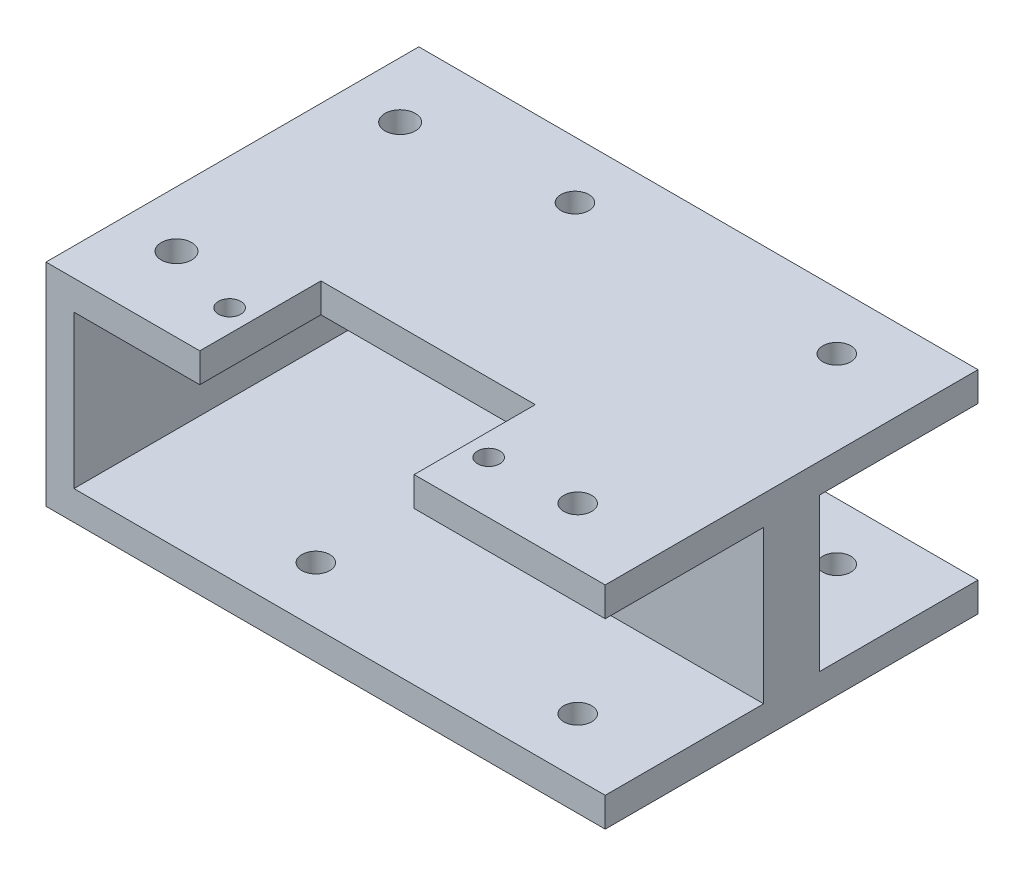
ISO-10303-21;
HEADER;
FILE_DESCRIPTION(('STEP AP214'),'2;1');
FILE_NAME('part.step','',(''),(''),'','','');
FILE_SCHEMA(('AUTOMOTIVE_DESIGN { 1 0 10303 214 1 1 1 1 }'));
ENDSEC;
DATA;
#1=APPLICATION_CONTEXT('core data for automotive mechanical design processes');
#2=APPLICATION_PROTOCOL_DEFINITION('international standard','automotive_design',2000,#1);
#3=PRODUCT_CONTEXT('',#1,'mechanical');
#4=PRODUCT('Part','Part','',(#3));
#5=PRODUCT_RELATED_PRODUCT_CATEGORY('part','',(#4));
#6=PRODUCT_DEFINITION_FORMATION('','',#4);
#7=PRODUCT_DEFINITION_CONTEXT('part definition',#1,'design');
#8=PRODUCT_DEFINITION('design','',#6,#7);
#9=PRODUCT_DEFINITION_SHAPE('','',#8);
#10=(LENGTH_UNIT() NAMED_UNIT(*) SI_UNIT(.MILLI.,.METRE.));
#11=(NAMED_UNIT(*) PLANE_ANGLE_UNIT() SI_UNIT($,.RADIAN.));
#12=(NAMED_UNIT(*) SI_UNIT($,.STERADIAN.) SOLID_ANGLE_UNIT());
#13=UNCERTAINTY_MEASURE_WITH_UNIT(LENGTH_MEASURE(1.E-05),#10,'distance_accuracy_value','');
#14=(GEOMETRIC_REPRESENTATION_CONTEXT(3) GLOBAL_UNCERTAINTY_ASSIGNED_CONTEXT((#13)) GLOBAL_UNIT_ASSIGNED_CONTEXT((#10,
#11,#12)) REPRESENTATION_CONTEXT('',''));
#15=CARTESIAN_POINT('',(0.,0.,0.));
#16=DIRECTION('',(0.,0.,1.));
#17=DIRECTION('',(1.,0.,0.));
#18=AXIS2_PLACEMENT_3D('',#15,#16,#17);
#19=CARTESIAN_POINT('',(0.,-3.15,20.));
#20=DIRECTION('',(0.,0.,1.));
#21=DIRECTION('',(1.,0.,0.));
#22=AXIS2_PLACEMENT_3D('',#19,#20,#21);
#23=PLANE('',#22);
#24=DIRECTION('',(0.,1.,0.));
#25=VECTOR('',#24,1.);
#26=CARTESIAN_POINT('',(16.5,12.55,20.));
#27=LINE('',#26,#25);
#28=CARTESIAN_POINT('',(16.5,16.4,20.));
#29=VERTEX_POINT('',#28);
#30=CARTESIAN_POINT('',(16.5,19.55,20.));
#31=VERTEX_POINT('',#30);
#32=EDGE_CURVE('E150',#29,#31,#27,.T.);
#33=ORIENTED_EDGE('',*,*,#32,.T.);
#34=DIRECTION('',(1.,0.,0.));
#35=VECTOR('',#34,1.);
#36=CARTESIAN_POINT('',(0.,19.55,20.));
#37=LINE('',#36,#35);
#38=CARTESIAN_POINT('',(0.,19.55,20.));
#39=VERTEX_POINT('',#38);
#40=EDGE_CURVE('E164',#39,#31,#37,.T.);
#41=ORIENTED_EDGE('',*,*,#40,.F.);
#42=DIRECTION('',(0.,1.,0.));
#43=VECTOR('',#42,1.);
#44=CARTESIAN_POINT('',(0.,-3.15,20.));
#45=LINE('',#44,#43);
#46=CARTESIAN_POINT('',(0.,-3.15,20.));
#47=VERTEX_POINT('',#46);
#48=EDGE_CURVE('E226',#47,#39,#45,.T.);
#49=ORIENTED_EDGE('',*,*,#48,.F.);
#50=DIRECTION('',(1.,0.,0.));
#51=VECTOR('',#50,1.);
#52=CARTESIAN_POINT('',(0.,-3.15,20.));
#53=LINE('',#52,#51);
#54=CARTESIAN_POINT('',(60.,-3.15,20.));
#55=VERTEX_POINT('',#54);
#56=EDGE_CURVE('E216',#47,#55,#53,.T.);
#57=ORIENTED_EDGE('',*,*,#56,.T.);
#58=DIRECTION('',(0.,1.,0.));
#59=VECTOR('',#58,1.);
#60=CARTESIAN_POINT('',(60.,-3.15,20.));
#61=LINE('',#60,#59);
#62=CARTESIAN_POINT('',(60.,0.,20.));
#63=VERTEX_POINT('',#62);
#64=EDGE_CURVE('E235',#55,#63,#61,.T.);
#65=ORIENTED_EDGE('',*,*,#64,.T.);
#66=DIRECTION('',(1.,0.,0.));
#67=VECTOR('',#66,1.);
#68=CARTESIAN_POINT('',(0.,0.,20.));
#69=LINE('',#68,#67);
#70=CARTESIAN_POINT('',(3.,0.,20.));
#71=VERTEX_POINT('',#70);
#72=EDGE_CURVE('E208',#71,#63,#69,.T.);
#73=ORIENTED_EDGE('',*,*,#72,.F.);
#74=DIRECTION('',(0.,-1.,0.));
#75=VECTOR('',#74,1.);
#76=CARTESIAN_POINT('',(3.,56.5123422402632,20.));
#77=LINE('',#76,#75);
#78=CARTESIAN_POINT('',(3.,16.4,20.));
#79=VERTEX_POINT('',#78);
#80=EDGE_CURVE('E200',#79,#71,#77,.T.);
#81=ORIENTED_EDGE('',*,*,#80,.F.);
#82=DIRECTION('',(1.,0.,0.));
#83=VECTOR('',#82,1.);
#84=CARTESIAN_POINT('',(0.,16.4,20.));
#85=LINE('',#84,#83);
#86=EDGE_CURVE('E168',#79,#29,#85,.T.);
#87=ORIENTED_EDGE('',*,*,#86,.T.);
#88=EDGE_LOOP('',(#33,#41,#49,#57,#65,#73,#81,#87));
#89=FACE_BOUND('',#88,.T.);
#90=ADVANCED_FACE('F33',(#89),#23,.T.);
#91=CARTESIAN_POINT('',(0.,0.,0.));
#92=DIRECTION('',(0.,1.,0.));
#93=DIRECTION('',(0.,0.,1.));
#94=AXIS2_PLACEMENT_3D('',#91,#92,#93);
#95=PLANE('',#94);
#96=CARTESIAN_POINT('',(50.95,0.,13.9));
#97=DIRECTION('',(0.,1.,0.));
#98=DIRECTION('',(0.,0.,1.));
#99=AXIS2_PLACEMENT_3D('',#96,#97,#98);
#100=CIRCLE('',#99,1.49999999999999);
#101=CARTESIAN_POINT('',(50.95,0.,15.4));
#102=VERTEX_POINT('',#101);
#103=EDGE_CURVE('E246',#102,#102,#100,.T.);
#104=ORIENTED_EDGE('',*,*,#103,.F.);
#105=EDGE_LOOP('',(#104));
#106=FACE_BOUND('',#105,.T.);
#107=CARTESIAN_POINT('',(22.85,0.,-13.9));
#108=DIRECTION('',(0.,1.,0.));
#109=DIRECTION('',(0.,0.,1.));
#110=AXIS2_PLACEMENT_3D('',#107,#108,#109);
#111=CIRCLE('',#110,1.49999999999999);
#112=CARTESIAN_POINT('',(22.85,0.,-12.4));
#113=VERTEX_POINT('',#112);
#114=EDGE_CURVE('E290',#113,#113,#111,.T.);
#115=ORIENTED_EDGE('',*,*,#114,.F.);
#116=EDGE_LOOP('',(#115));
#117=FACE_BOUND('',#116,.T.);
#118=CARTESIAN_POINT('',(50.95,0.,-13.9));
#119=DIRECTION('',(0.,1.,0.));
#120=DIRECTION('',(0.,0.,1.));
#121=AXIS2_PLACEMENT_3D('',#118,#119,#120);
#122=CIRCLE('',#121,1.49999999999999);
#123=CARTESIAN_POINT('',(50.95,0.,-12.4));
#124=VERTEX_POINT('',#123);
#125=EDGE_CURVE('E242',#124,#124,#122,.T.);
#126=ORIENTED_EDGE('',*,*,#125,.F.);
#127=EDGE_LOOP('',(#126));
#128=FACE_BOUND('',#127,.T.);
#129=CARTESIAN_POINT('',(22.85,0.,13.9));
#130=DIRECTION('',(0.,1.,0.));
#131=DIRECTION('',(0.,0.,1.));
#132=AXIS2_PLACEMENT_3D('',#129,#130,#131);
#133=CIRCLE('',#132,1.49999999999999);
#134=CARTESIAN_POINT('',(22.85,0.,15.4));
#135=VERTEX_POINT('',#134);
#136=EDGE_CURVE('E303',#135,#135,#133,.T.);
#137=ORIENTED_EDGE('',*,*,#136,.F.);
#138=EDGE_LOOP('',(#137));
#139=FACE_BOUND('',#138,.T.);
#140=DIRECTION('',(0.,0.,1.));
#141=VECTOR('',#140,1.);
#142=CARTESIAN_POINT('',(40.,0.,-3.00000000000002));
#143=LINE('',#142,#141);
#144=CARTESIAN_POINT('',(40.,0.,-3.00000000000002));
#145=VERTEX_POINT('',#144);
#146=CARTESIAN_POINT('',(40.,0.,2.99999999999998));
#147=VERTEX_POINT('',#146);
#148=EDGE_CURVE('E58',#145,#147,#143,.T.);
#149=ORIENTED_EDGE('',*,*,#148,.F.);
#150=DIRECTION('',(-1.,0.,0.));
#151=VECTOR('',#150,1.);
#152=CARTESIAN_POINT('',(60.,0.,-2.99999999999998));
#153=LINE('',#152,#151);
#154=CARTESIAN_POINT('',(60.,0.,-2.99999999999998));
#155=VERTEX_POINT('',#154);
#156=EDGE_CURVE('E326',#155,#145,#153,.T.);
#157=ORIENTED_EDGE('',*,*,#156,.F.);
#158=DIRECTION('',(0.,0.,-1.));
#159=VECTOR('',#158,1.);
#160=CARTESIAN_POINT('',(60.,0.,-20.));
#161=LINE('',#160,#159);
#162=CARTESIAN_POINT('',(60.,0.,-20.));
#163=VERTEX_POINT('',#162);
#164=EDGE_CURVE('E228',#155,#163,#161,.T.);
#165=ORIENTED_EDGE('',*,*,#164,.T.);
#166=DIRECTION('',(-1.,0.,0.));
#167=VECTOR('',#166,1.);
#168=CARTESIAN_POINT('',(0.,0.,-20.));
#169=LINE('',#168,#167);
#170=CARTESIAN_POINT('',(3.,0.,-20.));
#171=VERTEX_POINT('',#170);
#172=EDGE_CURVE('E217',#163,#171,#169,.T.);
#173=ORIENTED_EDGE('',*,*,#172,.T.);
#174=DIRECTION('',(0.,0.,-1.));
#175=VECTOR('',#174,1.);
#176=CARTESIAN_POINT('',(3.,0.,-20.));
#177=LINE('',#176,#175);
#178=EDGE_CURVE('E201',#71,#171,#177,.T.);
#179=ORIENTED_EDGE('',*,*,#178,.F.);
#180=ORIENTED_EDGE('',*,*,#72,.T.);
#181=CARTESIAN_POINT('',(60.,0.,2.99999999999998));
#182=VERTEX_POINT('',#181);
#183=EDGE_CURVE('E229',#63,#182,#161,.T.);
#184=ORIENTED_EDGE('',*,*,#183,.T.);
#185=DIRECTION('',(1.,0.,0.));
#186=VECTOR('',#185,1.);
#187=CARTESIAN_POINT('',(60.,0.,2.99999999999998));
#188=LINE('',#187,#186);
#189=EDGE_CURVE('E319',#147,#182,#188,.T.);
#190=ORIENTED_EDGE('',*,*,#189,.F.);
#191=EDGE_LOOP('',(#149,#157,#165,#173,#179,#180,#184,#190));
#192=FACE_BOUND('',#191,.T.);
#193=ADVANCED_FACE('F349',(#106,#117,#128,#139,#192),#95,.T.);
#194=CARTESIAN_POINT('',(0.,16.4,0.));
#195=DIRECTION('',(0.,1.,0.));
#196=DIRECTION('',(0.,0.,1.));
#197=AXIS2_PLACEMENT_3D('',#194,#195,#196);
#198=PLANE('',#197);
#199=CARTESIAN_POINT('',(6.,16.4,-12.));
#200=DIRECTION('',(0.,1.,0.));
#201=DIRECTION('',(0.,0.,1.));
#202=AXIS2_PLACEMENT_3D('',#199,#200,#201);
#203=CIRCLE('',#202,1.63194999999999);
#204=CARTESIAN_POINT('',(6.,16.4,-10.36805));
#205=VERTEX_POINT('',#204);
#206=EDGE_CURVE('E37',#205,#205,#203,.T.);
#207=ORIENTED_EDGE('',*,*,#206,.T.);
#208=EDGE_LOOP('',(#207));
#209=FACE_BOUND('',#208,.T.);
#210=CARTESIAN_POINT('',(6.,16.4,12.));
#211=DIRECTION('',(0.,1.,0.));
#212=DIRECTION('',(0.,0.,1.));
#213=AXIS2_PLACEMENT_3D('',#210,#211,#212);
#214=CIRCLE('',#213,1.63194999999999);
#215=CARTESIAN_POINT('',(6.,16.4,13.63195));
#216=VERTEX_POINT('',#215);
#217=EDGE_CURVE('E159',#216,#216,#214,.T.);
#218=ORIENTED_EDGE('',*,*,#217,.T.);
#219=EDGE_LOOP('',(#218));
#220=FACE_BOUND('',#219,.T.);
#221=CARTESIAN_POINT('',(50.95,16.4,13.9));
#222=DIRECTION('',(0.,1.,0.));
#223=DIRECTION('',(0.,0.,1.));
#224=AXIS2_PLACEMENT_3D('',#221,#222,#223);
#225=CIRCLE('',#224,1.49999999999999);
#226=CARTESIAN_POINT('',(50.95,16.4,15.4));
#227=VERTEX_POINT('',#226);
#228=EDGE_CURVE('E244',#227,#227,#225,.T.);
#229=ORIENTED_EDGE('',*,*,#228,.T.);
#230=EDGE_LOOP('',(#229));
#231=FACE_BOUND('',#230,.T.);
#232=CARTESIAN_POINT('',(22.85,16.4,-13.9));
#233=DIRECTION('',(0.,1.,0.));
#234=DIRECTION('',(0.,0.,1.));
#235=AXIS2_PLACEMENT_3D('',#232,#233,#234);
#236=CIRCLE('',#235,1.49999999999999);
#237=CARTESIAN_POINT('',(22.85,16.4,-12.4));
#238=VERTEX_POINT('',#237);
#239=EDGE_CURVE('E287',#238,#238,#236,.T.);
#240=ORIENTED_EDGE('',*,*,#239,.T.);
#241=EDGE_LOOP('',(#240));
#242=FACE_BOUND('',#241,.T.);
#243=CARTESIAN_POINT('',(50.95,16.4,-13.9));
#244=DIRECTION('',(0.,1.,0.));
#245=DIRECTION('',(0.,0.,1.));
#246=AXIS2_PLACEMENT_3D('',#243,#244,#245);
#247=CIRCLE('',#246,1.49999999999999);
#248=CARTESIAN_POINT('',(50.95,16.4,-12.4));
#249=VERTEX_POINT('',#248);
#250=EDGE_CURVE('E239',#249,#249,#247,.T.);
#251=ORIENTED_EDGE('',*,*,#250,.T.);
#252=EDGE_LOOP('',(#251));
#253=FACE_BOUND('',#252,.T.);
#254=CARTESIAN_POINT('',(14.1,16.4,14.4));
#255=DIRECTION('',(0.,1.,0.));
#256=DIRECTION('',(0.,0.,1.));
#257=AXIS2_PLACEMENT_3D('',#254,#255,#256);
#258=CIRCLE('',#257,1.2);
#259=CARTESIAN_POINT('',(14.1,16.4,15.6));
#260=VERTEX_POINT('',#259);
#261=EDGE_CURVE('E309',#260,#260,#258,.T.);
#262=ORIENTED_EDGE('',*,*,#261,.T.);
#263=EDGE_LOOP('',(#262));
#264=FACE_BOUND('',#263,.T.);
#265=CARTESIAN_POINT('',(41.9,16.4,14.4));
#266=DIRECTION('',(0.,1.,0.));
#267=DIRECTION('',(0.,0.,1.));
#268=AXIS2_PLACEMENT_3D('',#265,#266,#267);
#269=CIRCLE('',#268,1.2);
#270=CARTESIAN_POINT('',(41.9,16.4,15.6));
#271=VERTEX_POINT('',#270);
#272=EDGE_CURVE('E315',#271,#271,#269,.T.);
#273=ORIENTED_EDGE('',*,*,#272,.T.);
#274=EDGE_LOOP('',(#273));
#275=FACE_BOUND('',#274,.T.);
#276=DIRECTION('',(-1.,0.,0.));
#277=VECTOR('',#276,1.);
#278=CARTESIAN_POINT('',(0.,16.4,7.));
#279=LINE('',#278,#277);
#280=CARTESIAN_POINT('',(39.5,16.4,7.));
#281=VERTEX_POINT('',#280);
#282=CARTESIAN_POINT('',(16.5,16.4,7.));
#283=VERTEX_POINT('',#282);
#284=EDGE_CURVE('E269',#281,#283,#279,.T.);
#285=ORIENTED_EDGE('',*,*,#284,.T.);
#286=DIRECTION('',(0.,0.,1.));
#287=VECTOR('',#286,1.);
#288=CARTESIAN_POINT('',(16.5,16.4,0.));
#289=LINE('',#288,#287);
#290=EDGE_CURVE('E272',#283,#29,#289,.T.);
#291=ORIENTED_EDGE('',*,*,#290,.T.);
#292=ORIENTED_EDGE('',*,*,#86,.F.);
#293=DIRECTION('',(0.,0.,-1.));
#294=VECTOR('',#293,1.);
#295=CARTESIAN_POINT('',(3.,16.4,-20.));
#296=LINE('',#295,#294);
#297=CARTESIAN_POINT('',(3.,16.4,-20.));
#298=VERTEX_POINT('',#297);
#299=EDGE_CURVE('E205',#79,#298,#296,.T.);
#300=ORIENTED_EDGE('',*,*,#299,.T.);
#301=DIRECTION('',(-1.,0.,0.));
#302=VECTOR('',#301,1.);
#303=CARTESIAN_POINT('',(0.,16.4,-20.));
#304=LINE('',#303,#302);
#305=CARTESIAN_POINT('',(60.,16.4,-20.));
#306=VERTEX_POINT('',#305);
#307=EDGE_CURVE('E192',#306,#298,#304,.T.);
#308=ORIENTED_EDGE('',*,*,#307,.F.);
#309=DIRECTION('',(0.,0.,-1.));
#310=VECTOR('',#309,1.);
#311=CARTESIAN_POINT('',(60.,16.4,-20.));
#312=LINE('',#311,#310);
#313=CARTESIAN_POINT('',(60.,16.4,-3.00000000000002));
#314=VERTEX_POINT('',#313);
#315=EDGE_CURVE('E187',#314,#306,#312,.T.);
#316=ORIENTED_EDGE('',*,*,#315,.F.);
#317=DIRECTION('',(-1.,0.,0.));
#318=VECTOR('',#317,1.);
#319=CARTESIAN_POINT('',(60.,16.4,-2.99999999999998));
#320=LINE('',#319,#318);
#321=CARTESIAN_POINT('',(40.,16.4,-3.00000000000002));
#322=VERTEX_POINT('',#321);
#323=EDGE_CURVE('E333',#314,#322,#320,.T.);
#324=ORIENTED_EDGE('',*,*,#323,.T.);
#325=DIRECTION('',(0.,0.,1.));
#326=VECTOR('',#325,1.);
#327=CARTESIAN_POINT('',(40.,16.4,-3.00000000000002));
#328=LINE('',#327,#326);
#329=CARTESIAN_POINT('',(40.,16.4,2.99999999999998));
#330=VERTEX_POINT('',#329);
#331=EDGE_CURVE('E330',#322,#330,#328,.T.);
#332=ORIENTED_EDGE('',*,*,#331,.T.);
#333=DIRECTION('',(1.,0.,0.));
#334=VECTOR('',#333,1.);
#335=CARTESIAN_POINT('',(60.,16.4,2.99999999999998));
#336=LINE('',#335,#334);
#337=CARTESIAN_POINT('',(60.,16.4,2.99999999999998));
#338=VERTEX_POINT('',#337);
#339=EDGE_CURVE('E322',#330,#338,#336,.T.);
#340=ORIENTED_EDGE('',*,*,#339,.T.);
#341=CARTESIAN_POINT('',(60.,16.4,20.));
#342=VERTEX_POINT('',#341);
#343=EDGE_CURVE('E189',#342,#338,#312,.T.);
#344=ORIENTED_EDGE('',*,*,#343,.F.);
#345=CARTESIAN_POINT('',(39.5,16.4,20.));
#346=VERTEX_POINT('',#345);
#347=EDGE_CURVE('E188',#346,#342,#85,.T.);
#348=ORIENTED_EDGE('',*,*,#347,.F.);
#349=DIRECTION('',(0.,0.,-1.));
#350=VECTOR('',#349,1.);
#351=CARTESIAN_POINT('',(39.5,16.4,0.));
#352=LINE('',#351,#350);
#353=EDGE_CURVE('E263',#346,#281,#352,.T.);
#354=ORIENTED_EDGE('',*,*,#353,.T.);
#355=EDGE_LOOP('',(#285,#291,#292,#300,#308,#316,#324,#332,#340,#344,#348,#354));
#356=FACE_BOUND('',#355,.T.);
#357=ADVANCED_FACE('F370',(#209,#220,#231,#242,#253,#264,#275,#356),#198,.F.);
#358=CARTESIAN_POINT('',(0.,-3.15,-20.));
#359=DIRECTION('',(-1.,0.,0.));
#360=DIRECTION('',(0.,0.,1.));
#361=AXIS2_PLACEMENT_3D('',#358,#359,#360);
#362=PLANE('',#361);
#363=ORIENTED_EDGE('',*,*,#48,.T.);
#364=DIRECTION('',(0.,0.,1.));
#365=VECTOR('',#364,1.);
#366=CARTESIAN_POINT('',(0.,19.55,-20.));
#367=LINE('',#366,#365);
#368=CARTESIAN_POINT('',(0.,19.55,-20.));
#369=VERTEX_POINT('',#368);
#370=EDGE_CURVE('E175',#369,#39,#367,.T.);
#371=ORIENTED_EDGE('',*,*,#370,.F.);
#372=DIRECTION('',(0.,1.,0.));
#373=VECTOR('',#372,1.);
#374=CARTESIAN_POINT('',(0.,-3.15,-20.));
#375=LINE('',#374,#373);
#376=CARTESIAN_POINT('',(0.,-3.15,-20.));
#377=VERTEX_POINT('',#376);
#378=EDGE_CURVE('E11',#377,#369,#375,.T.);
#379=ORIENTED_EDGE('',*,*,#378,.F.);
#380=DIRECTION('',(0.,0.,1.));
#381=VECTOR('',#380,1.);
#382=CARTESIAN_POINT('',(0.,-3.15,-20.));
#383=LINE('',#382,#381);
#384=EDGE_CURVE('E213',#377,#47,#383,.T.);
#385=ORIENTED_EDGE('',*,*,#384,.T.);
#386=EDGE_LOOP('',(#363,#371,#379,#385));
#387=FACE_BOUND('',#386,.T.);
#388=ADVANCED_FACE('F35',(#387),#362,.T.);
#389=CARTESIAN_POINT('',(0.,-3.15,-20.));
#390=DIRECTION('',(0.,0.,-1.));
#391=DIRECTION('',(-1.,0.,0.));
#392=AXIS2_PLACEMENT_3D('',#389,#390,#391);
#393=PLANE('',#392);
#394=ORIENTED_EDGE('',*,*,#172,.F.);
#395=DIRECTION('',(0.,1.,0.));
#396=VECTOR('',#395,1.);
#397=CARTESIAN_POINT('',(60.,-3.15,-20.));
#398=LINE('',#397,#396);
#399=CARTESIAN_POINT('',(60.,-3.15,-20.));
#400=VERTEX_POINT('',#399);
#401=EDGE_CURVE('E42',#400,#163,#398,.T.);
#402=ORIENTED_EDGE('',*,*,#401,.F.);
#403=DIRECTION('',(-1.,0.,0.));
#404=VECTOR('',#403,1.);
#405=CARTESIAN_POINT('',(0.,-3.15,-20.));
#406=LINE('',#405,#404);
#407=EDGE_CURVE('E223',#400,#377,#406,.T.);
#408=ORIENTED_EDGE('',*,*,#407,.T.);
#409=ORIENTED_EDGE('',*,*,#378,.T.);
#410=DIRECTION('',(-1.,0.,0.));
#411=VECTOR('',#410,1.);
#412=CARTESIAN_POINT('',(0.,19.55,-20.));
#413=LINE('',#412,#411);
#414=CARTESIAN_POINT('',(60.,19.55,-20.));
#415=VERTEX_POINT('',#414);
#416=EDGE_CURVE('E179',#415,#369,#413,.T.);
#417=ORIENTED_EDGE('',*,*,#416,.F.);
#418=DIRECTION('',(0.,-1.,0.));
#419=VECTOR('',#418,1.);
#420=CARTESIAN_POINT('',(60.,19.55,-20.));
#421=LINE('',#420,#419);
#422=EDGE_CURVE('E185',#415,#306,#421,.T.);
#423=ORIENTED_EDGE('',*,*,#422,.T.);
#424=ORIENTED_EDGE('',*,*,#307,.T.);
#425=DIRECTION('',(0.,-1.,0.));
#426=VECTOR('',#425,1.);
#427=CARTESIAN_POINT('',(3.,56.5123422402632,-20.));
#428=LINE('',#427,#426);
#429=EDGE_CURVE('E204',#298,#171,#428,.T.);
#430=ORIENTED_EDGE('',*,*,#429,.T.);
#431=EDGE_LOOP('',(#394,#402,#408,#409,#417,#423,#424,#430));
#432=FACE_BOUND('',#431,.T.);
#433=ADVANCED_FACE('F359',(#432),#393,.T.);
#434=CARTESIAN_POINT('',(60.,-3.15,-20.));
#435=DIRECTION('',(1.,0.,0.));
#436=DIRECTION('',(0.,0.,-1.));
#437=AXIS2_PLACEMENT_3D('',#434,#435,#436);
#438=PLANE('',#437);
#439=ORIENTED_EDGE('',*,*,#183,.F.);
#440=ORIENTED_EDGE('',*,*,#64,.F.);
#441=DIRECTION('',(0.,0.,-1.));
#442=VECTOR('',#441,1.);
#443=CARTESIAN_POINT('',(60.,-3.15,-20.));
#444=LINE('',#443,#442);
#445=EDGE_CURVE('E220',#55,#400,#444,.T.);
#446=ORIENTED_EDGE('',*,*,#445,.T.);
#447=ORIENTED_EDGE('',*,*,#401,.T.);
#448=ORIENTED_EDGE('',*,*,#164,.F.);
#449=DIRECTION('',(0.,-1.,0.));
#450=VECTOR('',#449,1.);
#451=CARTESIAN_POINT('',(60.,56.5123422402632,-2.99999999999998));
#452=LINE('',#451,#450);
#453=EDGE_CURVE('E329',#314,#155,#452,.T.);
#454=ORIENTED_EDGE('',*,*,#453,.F.);
#455=ORIENTED_EDGE('',*,*,#315,.T.);
#456=ORIENTED_EDGE('',*,*,#422,.F.);
#457=DIRECTION('',(0.,0.,-1.));
#458=VECTOR('',#457,1.);
#459=CARTESIAN_POINT('',(60.,19.55,-20.));
#460=LINE('',#459,#458);
#461=CARTESIAN_POINT('',(60.,19.55,20.));
#462=VERTEX_POINT('',#461);
#463=EDGE_CURVE('E176',#462,#415,#460,.T.);
#464=ORIENTED_EDGE('',*,*,#463,.F.);
#465=DIRECTION('',(0.,-1.,0.));
#466=VECTOR('',#465,1.);
#467=CARTESIAN_POINT('',(60.,19.55,20.));
#468=LINE('',#467,#466);
#469=EDGE_CURVE('E197',#462,#342,#468,.T.);
#470=ORIENTED_EDGE('',*,*,#469,.T.);
#471=ORIENTED_EDGE('',*,*,#343,.T.);
#472=DIRECTION('',(0.,-1.,0.));
#473=VECTOR('',#472,1.);
#474=CARTESIAN_POINT('',(60.,56.5123422402632,2.99999999999998));
#475=LINE('',#474,#473);
#476=EDGE_CURVE('E318',#338,#182,#475,.T.);
#477=ORIENTED_EDGE('',*,*,#476,.T.);
#478=EDGE_LOOP('',(#439,#440,#446,#447,#448,#454,#455,#456,#464,#470,#471,#477));
#479=FACE_BOUND('',#478,.T.);
#480=ADVANCED_FACE('F342',(#479),#438,.T.);
#481=DIRECTION('',(0.,1.,0.));
#482=VECTOR('',#481,1.);
#483=CARTESIAN_POINT('',(39.5,12.55,20.));
#484=LINE('',#483,#482);
#485=CARTESIAN_POINT('',(39.5,19.55,20.));
#486=VERTEX_POINT('',#485);
#487=EDGE_CURVE('E50',#346,#486,#484,.T.);
#488=ORIENTED_EDGE('',*,*,#487,.F.);
#489=ORIENTED_EDGE('',*,*,#347,.T.);
#490=ORIENTED_EDGE('',*,*,#469,.F.);
#491=EDGE_CURVE('E177',#486,#462,#37,.T.);
#492=ORIENTED_EDGE('',*,*,#491,.F.);
#493=EDGE_LOOP('',(#488,#489,#490,#492));
#494=FACE_BOUND('',#493,.T.);
#495=ADVANCED_FACE('F383',(#494),#23,.T.);
#496=CARTESIAN_POINT('',(0.,-3.15,0.));
#497=DIRECTION('',(0.,1.,0.));
#498=DIRECTION('',(0.,0.,1.));
#499=AXIS2_PLACEMENT_3D('',#496,#497,#498);
#500=PLANE('',#499);
#501=CARTESIAN_POINT('',(50.95,-3.15,13.9));
#502=DIRECTION('',(0.,1.,0.));
#503=DIRECTION('',(0.,0.,1.));
#504=AXIS2_PLACEMENT_3D('',#501,#502,#503);
#505=CIRCLE('',#504,1.49999999999999);
#506=CARTESIAN_POINT('',(50.95,-3.15,15.4));
#507=VERTEX_POINT('',#506);
#508=EDGE_CURVE('E247',#507,#507,#505,.T.);
#509=ORIENTED_EDGE('',*,*,#508,.T.);
#510=EDGE_LOOP('',(#509));
#511=FACE_BOUND('',#510,.T.);
#512=CARTESIAN_POINT('',(22.85,-3.15,-13.9));
#513=DIRECTION('',(0.,1.,0.));
#514=DIRECTION('',(0.,0.,1.));
#515=AXIS2_PLACEMENT_3D('',#512,#513,#514);
#516=CIRCLE('',#515,1.49999999999999);
#517=CARTESIAN_POINT('',(22.85,-3.15,-12.4));
#518=VERTEX_POINT('',#517);
#519=EDGE_CURVE('E284',#518,#518,#516,.T.);
#520=ORIENTED_EDGE('',*,*,#519,.T.);
#521=EDGE_LOOP('',(#520));
#522=FACE_BOUND('',#521,.T.);
#523=CARTESIAN_POINT('',(50.95,-3.15,-13.9));
#524=DIRECTION('',(0.,1.,0.));
#525=DIRECTION('',(0.,0.,1.));
#526=AXIS2_PLACEMENT_3D('',#523,#524,#525);
#527=CIRCLE('',#526,1.49999999999999);
#528=CARTESIAN_POINT('',(50.95,-3.15,-12.4));
#529=VERTEX_POINT('',#528);
#530=EDGE_CURVE('E243',#529,#529,#527,.T.);
#531=ORIENTED_EDGE('',*,*,#530,.T.);
#532=EDGE_LOOP('',(#531));
#533=FACE_BOUND('',#532,.T.);
#534=CARTESIAN_POINT('',(22.85,-3.15,13.9));
#535=DIRECTION('',(0.,1.,0.));
#536=DIRECTION('',(0.,0.,1.));
#537=AXIS2_PLACEMENT_3D('',#534,#535,#536);
#538=CIRCLE('',#537,1.49999999999999);
#539=CARTESIAN_POINT('',(22.85,-3.15,15.4));
#540=VERTEX_POINT('',#539);
#541=EDGE_CURVE('E300',#540,#540,#538,.T.);
#542=ORIENTED_EDGE('',*,*,#541,.T.);
#543=EDGE_LOOP('',(#542));
#544=FACE_BOUND('',#543,.T.);
#545=ORIENTED_EDGE('',*,*,#384,.F.);
#546=ORIENTED_EDGE('',*,*,#407,.F.);
#547=ORIENTED_EDGE('',*,*,#445,.F.);
#548=ORIENTED_EDGE('',*,*,#56,.F.);
#549=EDGE_LOOP('',(#545,#546,#547,#548));
#550=FACE_BOUND('',#549,.T.);
#551=ADVANCED_FACE('F356',(#511,#522,#533,#544,#550),#500,.F.);
#552=CARTESIAN_POINT('',(3.,56.5123422402632,-20.));
#553=DIRECTION('',(-1.,0.,0.));
#554=DIRECTION('',(0.,0.,1.));
#555=AXIS2_PLACEMENT_3D('',#552,#553,#554);
#556=PLANE('',#555);
#557=ORIENTED_EDGE('',*,*,#299,.F.);
#558=ORIENTED_EDGE('',*,*,#80,.T.);
#559=ORIENTED_EDGE('',*,*,#178,.T.);
#560=ORIENTED_EDGE('',*,*,#429,.F.);
#561=EDGE_LOOP('',(#557,#558,#559,#560));
#562=FACE_BOUND('',#561,.T.);
#563=ADVANCED_FACE('F396',(#562),#556,.F.);
#564=CARTESIAN_POINT('',(0.,19.55,0.));
#565=DIRECTION('',(0.,1.,0.));
#566=DIRECTION('',(0.,0.,1.));
#567=AXIS2_PLACEMENT_3D('',#564,#565,#566);
#568=PLANE('',#567);
#569=CARTESIAN_POINT('',(6.,19.55,-12.));
#570=DIRECTION('',(0.,1.,0.));
#571=DIRECTION('',(0.,0.,1.));
#572=AXIS2_PLACEMENT_3D('',#569,#570,#571);
#573=CIRCLE('',#572,1.63194999999999);
#574=CARTESIAN_POINT('',(6.,19.55,-10.36805));
#575=VERTEX_POINT('',#574);
#576=EDGE_CURVE('E257',#575,#575,#573,.T.);
#577=ORIENTED_EDGE('',*,*,#576,.F.);
#578=EDGE_LOOP('',(#577));
#579=FACE_BOUND('',#578,.T.);
#580=CARTESIAN_POINT('',(6.,19.55,12.));
#581=DIRECTION('',(0.,1.,0.));
#582=DIRECTION('',(0.,0.,1.));
#583=AXIS2_PLACEMENT_3D('',#580,#581,#582);
#584=CIRCLE('',#583,1.63194999999999);
#585=CARTESIAN_POINT('',(6.,19.55,13.63195));
#586=VERTEX_POINT('',#585);
#587=EDGE_CURVE('E249',#586,#586,#584,.T.);
#588=ORIENTED_EDGE('',*,*,#587,.F.);
#589=EDGE_LOOP('',(#588));
#590=FACE_BOUND('',#589,.T.);
#591=DIRECTION('',(0.,0.,1.));
#592=VECTOR('',#591,1.);
#593=CARTESIAN_POINT('',(16.5,19.55,20.));
#594=LINE('',#593,#592);
#595=CARTESIAN_POINT('',(16.5,19.55,7.));
#596=VERTEX_POINT('',#595);
#597=EDGE_CURVE('E147',#596,#31,#594,.T.);
#598=ORIENTED_EDGE('',*,*,#597,.F.);
#599=DIRECTION('',(-1.,0.,0.));
#600=VECTOR('',#599,1.);
#601=CARTESIAN_POINT('',(16.5,19.55,7.));
#602=LINE('',#601,#600);
#603=CARTESIAN_POINT('',(39.5,19.55,7.));
#604=VERTEX_POINT('',#603);
#605=EDGE_CURVE('E169',#604,#596,#602,.T.);
#606=ORIENTED_EDGE('',*,*,#605,.F.);
#607=DIRECTION('',(0.,0.,-1.));
#608=VECTOR('',#607,1.);
#609=CARTESIAN_POINT('',(39.5,19.55,20.));
#610=LINE('',#609,#608);
#611=EDGE_CURVE('E158',#486,#604,#610,.T.);
#612=ORIENTED_EDGE('',*,*,#611,.F.);
#613=ORIENTED_EDGE('',*,*,#491,.T.);
#614=ORIENTED_EDGE('',*,*,#463,.T.);
#615=ORIENTED_EDGE('',*,*,#416,.T.);
#616=ORIENTED_EDGE('',*,*,#370,.T.);
#617=ORIENTED_EDGE('',*,*,#40,.T.);
#618=EDGE_LOOP('',(#598,#606,#612,#613,#614,#615,#616,#617));
#619=FACE_BOUND('',#618,.T.);
#620=CARTESIAN_POINT('',(50.95,19.55,13.9));
#621=DIRECTION('',(0.,1.,0.));
#622=DIRECTION('',(0.,0.,1.));
#623=AXIS2_PLACEMENT_3D('',#620,#621,#622);
#624=CIRCLE('',#623,1.49999999999999);
#625=CARTESIAN_POINT('',(50.95,19.55,15.4));
#626=VERTEX_POINT('',#625);
#627=EDGE_CURVE('E274',#626,#626,#624,.T.);
#628=ORIENTED_EDGE('',*,*,#627,.F.);
#629=EDGE_LOOP('',(#628));
#630=FACE_BOUND('',#629,.T.);
#631=CARTESIAN_POINT('',(22.85,19.55,-13.9));
#632=DIRECTION('',(0.,1.,0.));
#633=DIRECTION('',(0.,0.,1.));
#634=AXIS2_PLACEMENT_3D('',#631,#632,#633);
#635=CIRCLE('',#634,1.49999999999999);
#636=CARTESIAN_POINT('',(22.85,19.55,-12.4));
#637=VERTEX_POINT('',#636);
#638=EDGE_CURVE('E281',#637,#637,#635,.T.);
#639=ORIENTED_EDGE('',*,*,#638,.F.);
#640=EDGE_LOOP('',(#639));
#641=FACE_BOUND('',#640,.T.);
#642=CARTESIAN_POINT('',(50.95,19.55,-13.9));
#643=DIRECTION('',(0.,1.,0.));
#644=DIRECTION('',(0.,0.,1.));
#645=AXIS2_PLACEMENT_3D('',#642,#643,#644);
#646=CIRCLE('',#645,1.49999999999999);
#647=CARTESIAN_POINT('',(50.95,19.55,-12.4));
#648=VERTEX_POINT('',#647);
#649=EDGE_CURVE('E293',#648,#648,#646,.T.);
#650=ORIENTED_EDGE('',*,*,#649,.F.);
#651=EDGE_LOOP('',(#650));
#652=FACE_BOUND('',#651,.T.);
#653=CARTESIAN_POINT('',(14.1,19.55,14.4));
#654=DIRECTION('',(0.,1.,0.));
#655=DIRECTION('',(0.,0.,1.));
#656=AXIS2_PLACEMENT_3D('',#653,#654,#655);
#657=CIRCLE('',#656,1.2);
#658=CARTESIAN_POINT('',(14.1,19.55,15.6));
#659=VERTEX_POINT('',#658);
#660=EDGE_CURVE('E306',#659,#659,#657,.T.);
#661=ORIENTED_EDGE('',*,*,#660,.F.);
#662=EDGE_LOOP('',(#661));
#663=FACE_BOUND('',#662,.T.);
#664=CARTESIAN_POINT('',(41.9,19.55,14.4));
#665=DIRECTION('',(0.,1.,0.));
#666=DIRECTION('',(0.,0.,1.));
#667=AXIS2_PLACEMENT_3D('',#664,#665,#666);
#668=CIRCLE('',#667,1.2);
#669=CARTESIAN_POINT('',(41.9,19.55,15.6));
#670=VERTEX_POINT('',#669);
#671=EDGE_CURVE('E312',#670,#670,#668,.T.);
#672=ORIENTED_EDGE('',*,*,#671,.F.);
#673=EDGE_LOOP('',(#672));
#674=FACE_BOUND('',#673,.T.);
#675=ADVANCED_FACE('F171',(#579,#590,#619,#630,#641,#652,#663,#674),#568,.T.);
#676=CARTESIAN_POINT('',(60.,56.5123422402632,-2.99999999999998));
#677=DIRECTION('',(0.,0.,1.));
#678=DIRECTION('',(1.,0.,0.));
#679=AXIS2_PLACEMENT_3D('',#676,#677,#678);
#680=PLANE('',#679);
#681=ORIENTED_EDGE('',*,*,#323,.F.);
#682=ORIENTED_EDGE('',*,*,#453,.T.);
#683=ORIENTED_EDGE('',*,*,#156,.T.);
#684=DIRECTION('',(0.,-1.,0.));
#685=VECTOR('',#684,1.);
#686=CARTESIAN_POINT('',(40.,56.5123422402632,-3.00000000000002));
#687=LINE('',#686,#685);
#688=EDGE_CURVE('E325',#322,#145,#687,.T.);
#689=ORIENTED_EDGE('',*,*,#688,.F.);
#690=EDGE_LOOP('',(#681,#682,#683,#689));
#691=FACE_BOUND('',#690,.T.);
#692=ADVANCED_FACE('F366',(#691),#680,.F.);
#693=CARTESIAN_POINT('',(40.,56.5123422402632,-3.00000000000002));
#694=DIRECTION('',(1.,0.,0.));
#695=DIRECTION('',(0.,0.,-1.));
#696=AXIS2_PLACEMENT_3D('',#693,#694,#695);
#697=PLANE('',#696);
#698=ORIENTED_EDGE('',*,*,#331,.F.);
#699=ORIENTED_EDGE('',*,*,#688,.T.);
#700=ORIENTED_EDGE('',*,*,#148,.T.);
#701=DIRECTION('',(0.,-1.,0.));
#702=VECTOR('',#701,1.);
#703=CARTESIAN_POINT('',(40.,56.5123422402632,2.99999999999998));
#704=LINE('',#703,#702);
#705=EDGE_CURVE('E323',#330,#147,#704,.T.);
#706=ORIENTED_EDGE('',*,*,#705,.F.);
#707=EDGE_LOOP('',(#698,#699,#700,#706));
#708=FACE_BOUND('',#707,.T.);
#709=ADVANCED_FACE('F402',(#708),#697,.F.);
#710=CARTESIAN_POINT('',(60.,56.5123422402632,2.99999999999998));
#711=DIRECTION('',(0.,0.,-1.));
#712=DIRECTION('',(-1.,0.,0.));
#713=AXIS2_PLACEMENT_3D('',#710,#711,#712);
#714=PLANE('',#713);
#715=ORIENTED_EDGE('',*,*,#339,.F.);
#716=ORIENTED_EDGE('',*,*,#705,.T.);
#717=ORIENTED_EDGE('',*,*,#189,.T.);
#718=ORIENTED_EDGE('',*,*,#476,.F.);
#719=EDGE_LOOP('',(#715,#716,#717,#718));
#720=FACE_BOUND('',#719,.T.);
#721=ADVANCED_FACE('F347',(#720),#714,.F.);
#722=CARTESIAN_POINT('',(41.9,19.55,14.4));
#723=DIRECTION('',(0.,1.,0.));
#724=DIRECTION('',(0.,0.,1.));
#725=AXIS2_PLACEMENT_3D('',#722,#723,#724);
#726=CYLINDRICAL_SURFACE('',#725,1.2);
#727=ORIENTED_EDGE('',*,*,#671,.T.);
#728=EDGE_LOOP('',(#727));
#729=FACE_BOUND('',#728,.T.);
#730=ORIENTED_EDGE('',*,*,#272,.F.);
#731=EDGE_LOOP('',(#730));
#732=FACE_BOUND('',#731,.T.);
#733=ADVANCED_FACE('F409',(#729,#732),#726,.F.);
#734=CARTESIAN_POINT('',(14.1,19.55,14.4));
#735=DIRECTION('',(0.,1.,0.));
#736=DIRECTION('',(0.,0.,1.));
#737=AXIS2_PLACEMENT_3D('',#734,#735,#736);
#738=CYLINDRICAL_SURFACE('',#737,1.2);
#739=ORIENTED_EDGE('',*,*,#660,.T.);
#740=EDGE_LOOP('',(#739));
#741=FACE_BOUND('',#740,.T.);
#742=ORIENTED_EDGE('',*,*,#261,.F.);
#743=EDGE_LOOP('',(#742));
#744=FACE_BOUND('',#743,.T.);
#745=ADVANCED_FACE('F456',(#741,#744),#738,.F.);
#746=CARTESIAN_POINT('',(22.85,19.55,13.9));
#747=DIRECTION('',(0.,1.,0.));
#748=DIRECTION('',(0.,0.,1.));
#749=AXIS2_PLACEMENT_3D('',#746,#747,#748);
#750=CYLINDRICAL_SURFACE('',#749,1.49999999999999);
#751=ORIENTED_EDGE('',*,*,#136,.T.);
#752=EDGE_LOOP('',(#751));
#753=FACE_BOUND('',#752,.T.);
#754=ORIENTED_EDGE('',*,*,#541,.F.);
#755=EDGE_LOOP('',(#754));
#756=FACE_BOUND('',#755,.T.);
#757=ADVANCED_FACE('F453',(#753,#756),#750,.F.);
#758=CARTESIAN_POINT('',(50.95,19.55,-13.9));
#759=DIRECTION('',(0.,1.,0.));
#760=DIRECTION('',(0.,0.,1.));
#761=AXIS2_PLACEMENT_3D('',#758,#759,#760);
#762=CYLINDRICAL_SURFACE('',#761,1.49999999999999);
#763=ORIENTED_EDGE('',*,*,#649,.T.);
#764=EDGE_LOOP('',(#763));
#765=FACE_BOUND('',#764,.T.);
#766=ORIENTED_EDGE('',*,*,#250,.F.);
#767=EDGE_LOOP('',(#766));
#768=FACE_BOUND('',#767,.T.);
#769=ADVANCED_FACE('F451',(#765,#768),#762,.F.);
#770=ORIENTED_EDGE('',*,*,#125,.T.);
#771=EDGE_LOOP('',(#770));
#772=FACE_BOUND('',#771,.T.);
#773=ORIENTED_EDGE('',*,*,#530,.F.);
#774=EDGE_LOOP('',(#773));
#775=FACE_BOUND('',#774,.T.);
#776=ADVANCED_FACE('F447',(#772,#775),#762,.F.);
#777=CARTESIAN_POINT('',(22.85,19.55,-13.9));
#778=DIRECTION('',(0.,1.,0.));
#779=DIRECTION('',(0.,0.,1.));
#780=AXIS2_PLACEMENT_3D('',#777,#778,#779);
#781=CYLINDRICAL_SURFACE('',#780,1.49999999999999);
#782=ORIENTED_EDGE('',*,*,#114,.T.);
#783=EDGE_LOOP('',(#782));
#784=FACE_BOUND('',#783,.T.);
#785=ORIENTED_EDGE('',*,*,#519,.F.);
#786=EDGE_LOOP('',(#785));
#787=FACE_BOUND('',#786,.T.);
#788=ADVANCED_FACE('F443',(#784,#787),#781,.F.);
#789=ORIENTED_EDGE('',*,*,#638,.T.);
#790=EDGE_LOOP('',(#789));
#791=FACE_BOUND('',#790,.T.);
#792=ORIENTED_EDGE('',*,*,#239,.F.);
#793=EDGE_LOOP('',(#792));
#794=FACE_BOUND('',#793,.T.);
#795=ADVANCED_FACE('F446',(#791,#794),#781,.F.);
#796=CARTESIAN_POINT('',(50.95,19.55,13.9));
#797=DIRECTION('',(0.,1.,0.));
#798=DIRECTION('',(0.,0.,1.));
#799=AXIS2_PLACEMENT_3D('',#796,#797,#798);
#800=CYLINDRICAL_SURFACE('',#799,1.49999999999999);
#801=ORIENTED_EDGE('',*,*,#627,.T.);
#802=EDGE_LOOP('',(#801));
#803=FACE_BOUND('',#802,.T.);
#804=ORIENTED_EDGE('',*,*,#228,.F.);
#805=EDGE_LOOP('',(#804));
#806=FACE_BOUND('',#805,.T.);
#807=ADVANCED_FACE('F441',(#803,#806),#800,.F.);
#808=ORIENTED_EDGE('',*,*,#103,.T.);
#809=EDGE_LOOP('',(#808));
#810=FACE_BOUND('',#809,.T.);
#811=ORIENTED_EDGE('',*,*,#508,.F.);
#812=EDGE_LOOP('',(#811));
#813=FACE_BOUND('',#812,.T.);
#814=ADVANCED_FACE('F438',(#810,#813),#800,.F.);
#815=CARTESIAN_POINT('',(16.5,12.55,20.));
#816=DIRECTION('',(-1.,0.,0.));
#817=DIRECTION('',(0.,0.,1.));
#818=AXIS2_PLACEMENT_3D('',#815,#816,#817);
#819=PLANE('',#818);
#820=DIRECTION('',(0.,1.,0.));
#821=VECTOR('',#820,1.);
#822=CARTESIAN_POINT('',(16.5,12.55,7.));
#823=LINE('',#822,#821);
#824=EDGE_CURVE('E153',#283,#596,#823,.T.);
#825=ORIENTED_EDGE('',*,*,#824,.T.);
#826=ORIENTED_EDGE('',*,*,#597,.T.);
#827=ORIENTED_EDGE('',*,*,#32,.F.);
#828=ORIENTED_EDGE('',*,*,#290,.F.);
#829=EDGE_LOOP('',(#825,#826,#827,#828));
#830=FACE_BOUND('',#829,.T.);
#831=ADVANCED_FACE('F149',(#830),#819,.F.);
#832=CARTESIAN_POINT('',(16.5,12.55,7.));
#833=DIRECTION('',(0.,0.,-1.));
#834=DIRECTION('',(-1.,0.,0.));
#835=AXIS2_PLACEMENT_3D('',#832,#833,#834);
#836=PLANE('',#835);
#837=DIRECTION('',(0.,1.,0.));
#838=VECTOR('',#837,1.);
#839=CARTESIAN_POINT('',(39.5,12.55,7.));
#840=LINE('',#839,#838);
#841=EDGE_CURVE('E264',#281,#604,#840,.T.);
#842=ORIENTED_EDGE('',*,*,#841,.T.);
#843=ORIENTED_EDGE('',*,*,#605,.T.);
#844=ORIENTED_EDGE('',*,*,#824,.F.);
#845=ORIENTED_EDGE('',*,*,#284,.F.);
#846=EDGE_LOOP('',(#842,#843,#844,#845));
#847=FACE_BOUND('',#846,.T.);
#848=ADVANCED_FACE('F422',(#847),#836,.F.);
#849=CARTESIAN_POINT('',(39.5,12.55,20.));
#850=DIRECTION('',(1.,0.,0.));
#851=DIRECTION('',(0.,0.,-1.));
#852=AXIS2_PLACEMENT_3D('',#849,#850,#851);
#853=PLANE('',#852);
#854=ORIENTED_EDGE('',*,*,#487,.T.);
#855=ORIENTED_EDGE('',*,*,#611,.T.);
#856=ORIENTED_EDGE('',*,*,#841,.F.);
#857=ORIENTED_EDGE('',*,*,#353,.F.);
#858=EDGE_LOOP('',(#854,#855,#856,#857));
#859=FACE_BOUND('',#858,.T.);
#860=ADVANCED_FACE('F424',(#859),#853,.F.);
#861=CARTESIAN_POINT('',(6.,19.55,12.));
#862=DIRECTION('',(0.,1.,0.));
#863=DIRECTION('',(0.,0.,1.));
#864=AXIS2_PLACEMENT_3D('',#861,#862,#863);
#865=CYLINDRICAL_SURFACE('',#864,1.63194999999999);
#866=ORIENTED_EDGE('',*,*,#587,.T.);
#867=EDGE_LOOP('',(#866));
#868=FACE_BOUND('',#867,.T.);
#869=ORIENTED_EDGE('',*,*,#217,.F.);
#870=EDGE_LOOP('',(#869));
#871=FACE_BOUND('',#870,.T.);
#872=ADVANCED_FACE('F426',(#868,#871),#865,.F.);
#873=CARTESIAN_POINT('',(6.,19.55,-12.));
#874=DIRECTION('',(0.,1.,0.));
#875=DIRECTION('',(0.,0.,1.));
#876=AXIS2_PLACEMENT_3D('',#873,#874,#875);
#877=CYLINDRICAL_SURFACE('',#876,1.63194999999999);
#878=ORIENTED_EDGE('',*,*,#576,.T.);
#879=EDGE_LOOP('',(#878));
#880=FACE_BOUND('',#879,.T.);
#881=ORIENTED_EDGE('',*,*,#206,.F.);
#882=EDGE_LOOP('',(#881));
#883=FACE_BOUND('',#882,.T.);
#884=ADVANCED_FACE('F432',(#880,#883),#877,.F.);
#885=CLOSED_SHELL('',(#90,#193,#357,#388,#433,#480,#495,#551,#563,#675,#692,#709,#721,#733,#745,
#757,#769,#776,#788,#795,#807,#814,#831,#848,#860,#872,#884));
#886=MANIFOLD_SOLID_BREP('B2',#885);
#887=ADVANCED_BREP_SHAPE_REPRESENTATION('',(#18,#886),#14);
#888=SHAPE_DEFINITION_REPRESENTATION(#9,#887);
ENDSEC;
END-ISO-10303-21;
